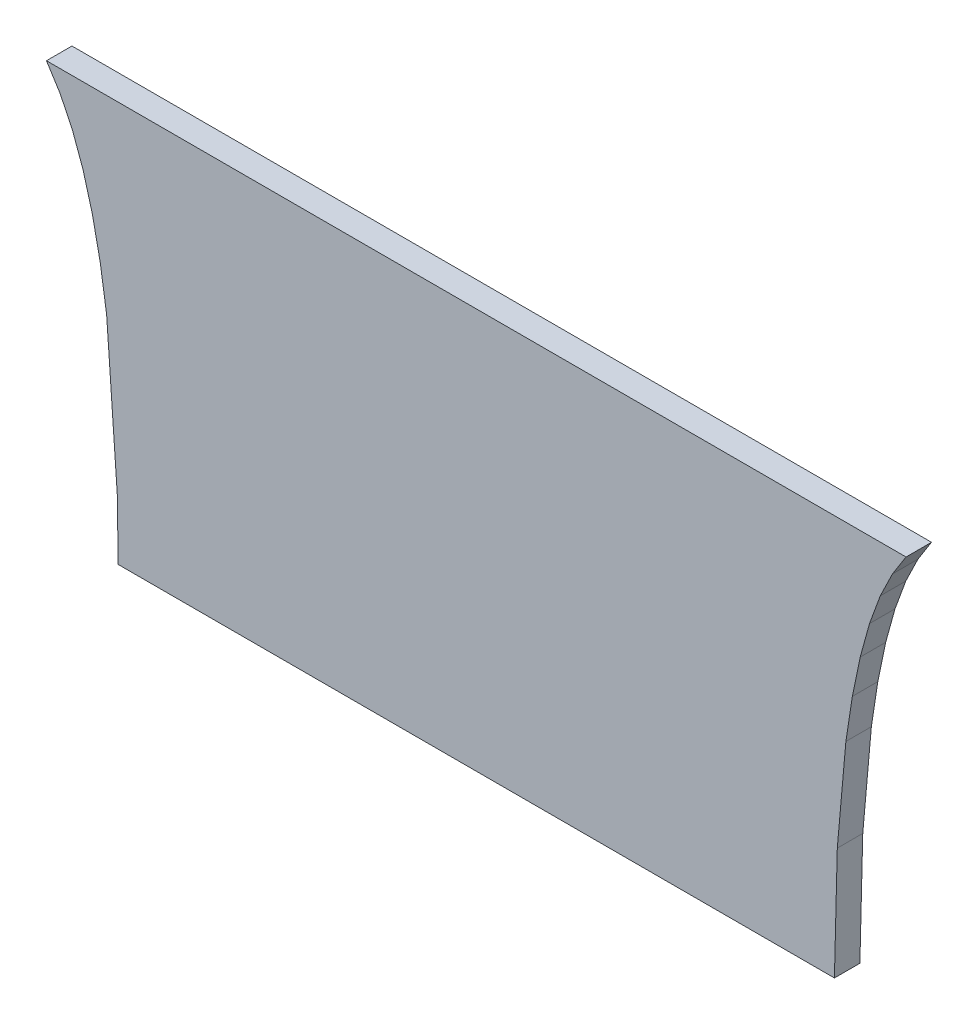
ISO-10303-21;
HEADER;
FILE_DESCRIPTION(('STEP AP214'),'2;1');
FILE_NAME('part.step','',(''),(''),'','','');
FILE_SCHEMA(('AUTOMOTIVE_DESIGN { 1 0 10303 214 1 1 1 1 }'));
ENDSEC;
DATA;
#1=APPLICATION_CONTEXT('core data for automotive mechanical design processes');
#2=APPLICATION_PROTOCOL_DEFINITION('international standard','automotive_design',2000,#1);
#3=PRODUCT_CONTEXT('',#1,'mechanical');
#4=PRODUCT('Part','Part','',(#3));
#5=PRODUCT_RELATED_PRODUCT_CATEGORY('part','',(#4));
#6=PRODUCT_DEFINITION_FORMATION('','',#4);
#7=PRODUCT_DEFINITION_CONTEXT('part definition',#1,'design');
#8=PRODUCT_DEFINITION('design','',#6,#7);
#9=PRODUCT_DEFINITION_SHAPE('','',#8);
#10=(LENGTH_UNIT() NAMED_UNIT(*) SI_UNIT(.MILLI.,.METRE.));
#11=(NAMED_UNIT(*) PLANE_ANGLE_UNIT() SI_UNIT($,.RADIAN.));
#12=(NAMED_UNIT(*) SI_UNIT($,.STERADIAN.) SOLID_ANGLE_UNIT());
#13=UNCERTAINTY_MEASURE_WITH_UNIT(LENGTH_MEASURE(1.E-05),#10,'distance_accuracy_value','');
#14=(GEOMETRIC_REPRESENTATION_CONTEXT(3) GLOBAL_UNCERTAINTY_ASSIGNED_CONTEXT((#13)) GLOBAL_UNIT_ASSIGNED_CONTEXT((#10,
#11,#12)) REPRESENTATION_CONTEXT('',''));
#15=CARTESIAN_POINT('',(0.,0.,0.));
#16=DIRECTION('',(0.,0.,1.));
#17=DIRECTION('',(1.,0.,0.));
#18=AXIS2_PLACEMENT_3D('',#15,#16,#17);
#19=CARTESIAN_POINT('',(88.4000015258789,42.5309982299805,0.));
#20=DIRECTION('',(-0.999684055752358,0.0251354067903474,0.));
#21=DIRECTION('',(0.0251354067903474,0.999684055752358,0.));
#22=AXIS2_PLACEMENT_3D('',#19,#20,#21);
#23=PLANE('',#22);
#24=DIRECTION('',(0.0251354067903474,0.999684055752358,0.));
#25=VECTOR('',#24,1.);
#26=CARTESIAN_POINT('',(88.4000015258789,42.5309982299805,0.03556));
#27=LINE('',#26,#25);
#28=CARTESIAN_POINT('',(88.4000015258789,42.5309982299805,0.03556));
#29=VERTEX_POINT('',#28);
#30=CARTESIAN_POINT('',(88.4039993286133,42.689998626709,0.03556));
#31=VERTEX_POINT('',#30);
#32=EDGE_CURVE('E11',#29,#31,#27,.T.);
#33=ORIENTED_EDGE('',*,*,#32,.F.);
#34=DIRECTION('',(0.,0.,1.));
#35=VECTOR('',#34,1.);
#36=CARTESIAN_POINT('',(88.4000015258789,42.5309982299805,0.));
#37=LINE('',#36,#35);
#38=CARTESIAN_POINT('',(88.4000015258789,42.5309982299805,0.));
#39=VERTEX_POINT('',#38);
#40=EDGE_CURVE('E24',#39,#29,#37,.T.);
#41=ORIENTED_EDGE('',*,*,#40,.F.);
#42=DIRECTION('',(0.0251354067903474,0.999684055752358,0.));
#43=VECTOR('',#42,1.);
#44=CARTESIAN_POINT('',(88.4000015258789,42.5309982299805,0.));
#45=LINE('',#44,#43);
#46=CARTESIAN_POINT('',(88.4039993286133,42.689998626709,0.));
#47=VERTEX_POINT('',#46);
#48=EDGE_CURVE('E160',#39,#47,#45,.T.);
#49=ORIENTED_EDGE('',*,*,#48,.T.);
#50=DIRECTION('',(0.,0.,1.));
#51=VECTOR('',#50,1.);
#52=CARTESIAN_POINT('',(88.4039993286133,42.689998626709,0.));
#53=LINE('',#52,#51);
#54=EDGE_CURVE('E37',#47,#31,#53,.T.);
#55=ORIENTED_EDGE('',*,*,#54,.T.);
#56=EDGE_LOOP('',(#33,#41,#49,#55));
#57=FACE_BOUND('',#56,.T.);
#58=ADVANCED_FACE('F17',(#57),#23,.F.);
#59=CARTESIAN_POINT('',(88.4039993286133,42.689998626709,0.));
#60=DIRECTION('',(-0.996072089069625,0.0885459958240475,0.));
#61=DIRECTION('',(0.0885459958240475,0.996072089069625,0.));
#62=AXIS2_PLACEMENT_3D('',#59,#60,#61);
#63=PLANE('',#62);
#64=DIRECTION('',(0.0885459958240475,0.996072089069625,0.));
#65=VECTOR('',#64,1.);
#66=CARTESIAN_POINT('',(88.4039993286133,42.689998626709,0.03556));
#67=LINE('',#66,#65);
#68=CARTESIAN_POINT('',(88.4160003662109,42.8250007629395,0.03556));
#69=VERTEX_POINT('',#68);
#70=EDGE_CURVE('E280',#31,#69,#67,.T.);
#71=ORIENTED_EDGE('',*,*,#70,.F.);
#72=ORIENTED_EDGE('',*,*,#54,.F.);
#73=DIRECTION('',(0.0885459958240475,0.996072089069625,0.));
#74=VECTOR('',#73,1.);
#75=CARTESIAN_POINT('',(88.4039993286133,42.689998626709,0.));
#76=LINE('',#75,#74);
#77=CARTESIAN_POINT('',(88.4160003662109,42.8250007629395,0.));
#78=VERTEX_POINT('',#77);
#79=EDGE_CURVE('E277',#47,#78,#76,.T.);
#80=ORIENTED_EDGE('',*,*,#79,.T.);
#81=DIRECTION('',(0.,0.,1.));
#82=VECTOR('',#81,1.);
#83=CARTESIAN_POINT('',(88.4160003662109,42.8250007629395,0.));
#84=LINE('',#83,#82);
#85=EDGE_CURVE('E275',#78,#69,#84,.T.);
#86=ORIENTED_EDGE('',*,*,#85,.T.);
#87=EDGE_LOOP('',(#71,#72,#80,#86));
#88=FACE_BOUND('',#87,.T.);
#89=ADVANCED_FACE('F288',(#88),#63,.F.);
#90=CARTESIAN_POINT('',(88.416000366211,42.8250007629395,0.));
#91=DIRECTION('',(-0.98855716875994,0.150846690694003,0.));
#92=DIRECTION('',(0.150846690694003,0.98855716875994,0.));
#93=AXIS2_PLACEMENT_3D('',#90,#91,#92);
#94=PLANE('',#93);
#95=DIRECTION('',(0.150846690694003,0.98855716875994,0.));
#96=VECTOR('',#95,1.);
#97=CARTESIAN_POINT('',(88.4160003662109,42.8250007629395,0.03556));
#98=LINE('',#97,#96);
#99=CARTESIAN_POINT('',(88.4250030517578,42.8839988708496,0.03556));
#100=VERTEX_POINT('',#99);
#101=EDGE_CURVE('E272',#69,#100,#98,.T.);
#102=ORIENTED_EDGE('',*,*,#101,.F.);
#103=ORIENTED_EDGE('',*,*,#85,.F.);
#104=DIRECTION('',(0.150846690694003,0.98855716875994,0.));
#105=VECTOR('',#104,1.);
#106=CARTESIAN_POINT('',(88.4160003662109,42.8250007629395,0.));
#107=LINE('',#106,#105);
#108=CARTESIAN_POINT('',(88.4250030517578,42.8839988708496,0.));
#109=VERTEX_POINT('',#108);
#110=EDGE_CURVE('E269',#78,#109,#107,.T.);
#111=ORIENTED_EDGE('',*,*,#110,.T.);
#112=DIRECTION('',(0.,0.,1.));
#113=VECTOR('',#112,1.);
#114=CARTESIAN_POINT('',(88.4250030517578,42.8839988708496,0.));
#115=LINE('',#114,#113);
#116=EDGE_CURVE('E267',#109,#100,#115,.T.);
#117=ORIENTED_EDGE('',*,*,#116,.T.);
#118=EDGE_LOOP('',(#102,#103,#111,#117));
#119=FACE_BOUND('',#118,.T.);
#120=ADVANCED_FACE('F294',(#119),#94,.F.);
#121=CARTESIAN_POINT('',(88.4250030517578,42.8839988708496,0.));
#122=DIRECTION('',(-0.979157113712778,0.203104275350527,0.));
#123=DIRECTION('',(0.203104275350527,0.979157113712778,0.));
#124=AXIS2_PLACEMENT_3D('',#121,#122,#123);
#125=PLANE('',#124);
#126=DIRECTION('',(0.203104275350527,0.979157113712778,0.));
#127=VECTOR('',#126,1.);
#128=CARTESIAN_POINT('',(88.4250030517578,42.8839988708496,0.03556));
#129=LINE('',#128,#127);
#130=CARTESIAN_POINT('',(88.4359970092774,42.9370002746582,0.03556));
#131=VERTEX_POINT('',#130);
#132=EDGE_CURVE('E264',#100,#131,#129,.T.);
#133=ORIENTED_EDGE('',*,*,#132,.F.);
#134=ORIENTED_EDGE('',*,*,#116,.F.);
#135=DIRECTION('',(0.203104275350527,0.979157113712778,0.));
#136=VECTOR('',#135,1.);
#137=CARTESIAN_POINT('',(88.4250030517578,42.8839988708496,0.));
#138=LINE('',#137,#136);
#139=CARTESIAN_POINT('',(88.4359970092774,42.9370002746582,0.));
#140=VERTEX_POINT('',#139);
#141=EDGE_CURVE('E261',#109,#140,#138,.T.);
#142=ORIENTED_EDGE('',*,*,#141,.T.);
#143=DIRECTION('',(0.,0.,1.));
#144=VECTOR('',#143,1.);
#145=CARTESIAN_POINT('',(88.4359970092774,42.9370002746582,0.));
#146=LINE('',#145,#144);
#147=EDGE_CURVE('E259',#140,#131,#146,.T.);
#148=ORIENTED_EDGE('',*,*,#147,.T.);
#149=EDGE_LOOP('',(#133,#134,#142,#148));
#150=FACE_BOUND('',#149,.T.);
#151=ADVANCED_FACE('F296',(#150),#125,.F.);
#152=CARTESIAN_POINT('',(88.4359970092774,42.9370002746582,0.));
#153=DIRECTION('',(-0.963809837327237,0.266590692769355,0.));
#154=DIRECTION('',(0.266590692769355,0.963809837327237,0.));
#155=AXIS2_PLACEMENT_3D('',#152,#153,#154);
#156=PLANE('',#155);
#157=DIRECTION('',(0.266590692769355,0.963809837327237,0.));
#158=VECTOR('',#157,1.);
#159=CARTESIAN_POINT('',(88.4359970092774,42.9370002746582,0.03556));
#160=LINE('',#159,#158);
#161=CARTESIAN_POINT('',(88.4489974975586,42.984001159668,0.03556));
#162=VERTEX_POINT('',#161);
#163=EDGE_CURVE('E256',#131,#162,#160,.T.);
#164=ORIENTED_EDGE('',*,*,#163,.F.);
#165=ORIENTED_EDGE('',*,*,#147,.F.);
#166=DIRECTION('',(0.266590692769355,0.963809837327237,0.));
#167=VECTOR('',#166,1.);
#168=CARTESIAN_POINT('',(88.4359970092774,42.9370002746582,0.));
#169=LINE('',#168,#167);
#170=CARTESIAN_POINT('',(88.4489974975586,42.984001159668,0.));
#171=VERTEX_POINT('',#170);
#172=EDGE_CURVE('E253',#140,#171,#169,.T.);
#173=ORIENTED_EDGE('',*,*,#172,.T.);
#174=DIRECTION('',(0.,0.,1.));
#175=VECTOR('',#174,1.);
#176=CARTESIAN_POINT('',(88.4489974975586,42.984001159668,0.));
#177=LINE('',#176,#175);
#178=EDGE_CURVE('E251',#171,#162,#177,.T.);
#179=ORIENTED_EDGE('',*,*,#178,.T.);
#180=EDGE_LOOP('',(#164,#165,#173,#179));
#181=FACE_BOUND('',#180,.T.);
#182=ADVANCED_FACE('F301',(#181),#156,.F.);
#183=CARTESIAN_POINT('',(88.4489974975586,42.984001159668,0.));
#184=DIRECTION('',(-0.939128353177272,0.343566494668128,0.));
#185=DIRECTION('',(0.343566494668128,0.939128353177272,0.));
#186=AXIS2_PLACEMENT_3D('',#183,#184,#185);
#187=PLANE('',#186);
#188=DIRECTION('',(0.343566494668128,0.939128353177272,0.));
#189=VECTOR('',#188,1.);
#190=CARTESIAN_POINT('',(88.4489974975586,42.984001159668,0.03556));
#191=LINE('',#190,#189);
#192=CARTESIAN_POINT('',(88.463996887207,43.0250015258789,0.03556));
#193=VERTEX_POINT('',#192);
#194=EDGE_CURVE('E248',#162,#193,#191,.T.);
#195=ORIENTED_EDGE('',*,*,#194,.F.);
#196=ORIENTED_EDGE('',*,*,#178,.F.);
#197=DIRECTION('',(0.343566494668128,0.939128353177272,0.));
#198=VECTOR('',#197,1.);
#199=CARTESIAN_POINT('',(88.4489974975586,42.984001159668,0.));
#200=LINE('',#199,#198);
#201=CARTESIAN_POINT('',(88.463996887207,43.0250015258789,0.));
#202=VERTEX_POINT('',#201);
#203=EDGE_CURVE('E245',#171,#202,#200,.T.);
#204=ORIENTED_EDGE('',*,*,#203,.T.);
#205=DIRECTION('',(0.,0.,1.));
#206=VECTOR('',#205,1.);
#207=CARTESIAN_POINT('',(88.463996887207,43.0250015258789,0.));
#208=LINE('',#207,#206);
#209=EDGE_CURVE('E243',#202,#193,#208,.T.);
#210=ORIENTED_EDGE('',*,*,#209,.T.);
#211=EDGE_LOOP('',(#195,#196,#204,#210));
#212=FACE_BOUND('',#211,.T.);
#213=ADVANCED_FACE('F304',(#212),#187,.F.);
#214=CARTESIAN_POINT('',(88.463996887207,43.0250015258789,0.));
#215=DIRECTION('',(-0.899447608111395,0.437028603483444,0.));
#216=DIRECTION('',(0.437028603483444,0.899447608111395,0.));
#217=AXIS2_PLACEMENT_3D('',#214,#215,#216);
#218=PLANE('',#217);
#219=DIRECTION('',(0.437028603483444,0.899447608111395,0.));
#220=VECTOR('',#219,1.);
#221=CARTESIAN_POINT('',(88.463996887207,43.0250015258789,0.03556));
#222=LINE('',#221,#220);
#223=CARTESIAN_POINT('',(88.4810028076172,43.060001373291,0.03556));
#224=VERTEX_POINT('',#223);
#225=EDGE_CURVE('E240',#193,#224,#222,.T.);
#226=ORIENTED_EDGE('',*,*,#225,.F.);
#227=ORIENTED_EDGE('',*,*,#209,.F.);
#228=DIRECTION('',(0.437028603483444,0.899447608111395,0.));
#229=VECTOR('',#228,1.);
#230=CARTESIAN_POINT('',(88.463996887207,43.0250015258789,0.));
#231=LINE('',#230,#229);
#232=CARTESIAN_POINT('',(88.4810028076172,43.060001373291,0.));
#233=VERTEX_POINT('',#232);
#234=EDGE_CURVE('E237',#202,#233,#231,.T.);
#235=ORIENTED_EDGE('',*,*,#234,.T.);
#236=DIRECTION('',(0.,0.,1.));
#237=VECTOR('',#236,1.);
#238=CARTESIAN_POINT('',(88.4810028076172,43.060001373291,0.));
#239=LINE('',#238,#237);
#240=EDGE_CURVE('E235',#233,#224,#239,.T.);
#241=ORIENTED_EDGE('',*,*,#240,.T.);
#242=EDGE_LOOP('',(#226,#227,#235,#241));
#243=FACE_BOUND('',#242,.T.);
#244=ADVANCED_FACE('F309',(#243),#218,.F.);
#245=CARTESIAN_POINT('',(88.4810028076172,43.060001373291,0.));
#246=DIRECTION('',(-0.844844974102474,0.535011186550142,0.));
#247=DIRECTION('',(0.535011186550142,0.844844974102474,0.));
#248=AXIS2_PLACEMENT_3D('',#245,#246,#247);
#249=PLANE('',#248);
#250=DIRECTION('',(0.535011186550142,0.844844974102474,0.));
#251=VECTOR('',#250,1.);
#252=CARTESIAN_POINT('',(88.4810028076172,43.060001373291,0.03556));
#253=LINE('',#252,#251);
#254=CARTESIAN_POINT('',(88.5,43.0900001525879,0.03556));
#255=VERTEX_POINT('',#254);
#256=EDGE_CURVE('E232',#224,#255,#253,.T.);
#257=ORIENTED_EDGE('',*,*,#256,.F.);
#258=ORIENTED_EDGE('',*,*,#240,.F.);
#259=DIRECTION('',(0.535011186550142,0.844844974102474,0.));
#260=VECTOR('',#259,1.);
#261=CARTESIAN_POINT('',(88.4810028076172,43.060001373291,0.));
#262=LINE('',#261,#260);
#263=CARTESIAN_POINT('',(88.5,43.0900001525879,0.));
#264=VERTEX_POINT('',#263);
#265=EDGE_CURVE('E229',#233,#264,#262,.T.);
#266=ORIENTED_EDGE('',*,*,#265,.T.);
#267=DIRECTION('',(0.,0.,1.));
#268=VECTOR('',#267,1.);
#269=CARTESIAN_POINT('',(88.5,43.0900001525879,0.));
#270=LINE('',#269,#268);
#271=EDGE_CURVE('E227',#264,#255,#270,.T.);
#272=ORIENTED_EDGE('',*,*,#271,.T.);
#273=EDGE_LOOP('',(#257,#258,#266,#272));
#274=FACE_BOUND('',#273,.T.);
#275=ADVANCED_FACE('F312',(#274),#249,.F.);
#276=CARTESIAN_POINT('',(88.5,43.0900001525879,0.));
#277=DIRECTION('',(0.,-1.,0.));
#278=DIRECTION('',(-1.,0.,0.));
#279=AXIS2_PLACEMENT_3D('',#276,#277,#278);
#280=PLANE('',#279);
#281=DIRECTION('',(-1.,0.,0.));
#282=VECTOR('',#281,1.);
#283=CARTESIAN_POINT('',(88.5,43.0900001525879,0.03556));
#284=LINE('',#283,#282);
#285=CARTESIAN_POINT('',(87.3000030517578,43.0900001525879,0.03556));
#286=VERTEX_POINT('',#285);
#287=EDGE_CURVE('E224',#255,#286,#284,.T.);
#288=ORIENTED_EDGE('',*,*,#287,.F.);
#289=ORIENTED_EDGE('',*,*,#271,.F.);
#290=DIRECTION('',(-1.,0.,0.));
#291=VECTOR('',#290,1.);
#292=CARTESIAN_POINT('',(88.5,43.0900001525879,0.));
#293=LINE('',#292,#291);
#294=CARTESIAN_POINT('',(87.3000030517578,43.0900001525879,0.));
#295=VERTEX_POINT('',#294);
#296=EDGE_CURVE('E221',#264,#295,#293,.T.);
#297=ORIENTED_EDGE('',*,*,#296,.T.);
#298=DIRECTION('',(0.,0.,1.));
#299=VECTOR('',#298,1.);
#300=CARTESIAN_POINT('',(87.3000030517578,43.0900001525879,0.));
#301=LINE('',#300,#299);
#302=EDGE_CURVE('E219',#295,#286,#301,.T.);
#303=ORIENTED_EDGE('',*,*,#302,.T.);
#304=EDGE_LOOP('',(#288,#289,#297,#303));
#305=FACE_BOUND('',#304,.T.);
#306=ADVANCED_FACE('F317',(#305),#280,.F.);
#307=CARTESIAN_POINT('',(87.3000030517578,43.0900001525879,0.));
#308=DIRECTION('',(0.844844974102474,0.535011186550142,0.));
#309=DIRECTION('',(0.535011186550142,-0.844844974102474,0.));
#310=AXIS2_PLACEMENT_3D('',#307,#308,#309);
#311=PLANE('',#310);
#312=DIRECTION('',(0.535011186550142,-0.844844974102474,0.));
#313=VECTOR('',#312,1.);
#314=CARTESIAN_POINT('',(87.3000030517578,43.0900001525879,0.03556));
#315=LINE('',#314,#313);
#316=CARTESIAN_POINT('',(87.3190002441406,43.060001373291,0.03556));
#317=VERTEX_POINT('',#316);
#318=EDGE_CURVE('E216',#286,#317,#315,.T.);
#319=ORIENTED_EDGE('',*,*,#318,.F.);
#320=ORIENTED_EDGE('',*,*,#302,.F.);
#321=DIRECTION('',(0.535011186550142,-0.844844974102474,0.));
#322=VECTOR('',#321,1.);
#323=CARTESIAN_POINT('',(87.3000030517578,43.0900001525879,0.));
#324=LINE('',#323,#322);
#325=CARTESIAN_POINT('',(87.3190002441406,43.060001373291,0.));
#326=VERTEX_POINT('',#325);
#327=EDGE_CURVE('E213',#295,#326,#324,.T.);
#328=ORIENTED_EDGE('',*,*,#327,.T.);
#329=DIRECTION('',(0.,0.,1.));
#330=VECTOR('',#329,1.);
#331=CARTESIAN_POINT('',(87.3190002441406,43.060001373291,0.));
#332=LINE('',#331,#330);
#333=EDGE_CURVE('E211',#326,#317,#332,.T.);
#334=ORIENTED_EDGE('',*,*,#333,.T.);
#335=EDGE_LOOP('',(#319,#320,#328,#334));
#336=FACE_BOUND('',#335,.T.);
#337=ADVANCED_FACE('F320',(#336),#311,.F.);
#338=CARTESIAN_POINT('',(87.3190002441406,43.060001373291,0.));
#339=DIRECTION('',(0.89952467075599,0.43686996543746,0.));
#340=DIRECTION('',(0.43686996543746,-0.89952467075599,0.));
#341=AXIS2_PLACEMENT_3D('',#338,#339,#340);
#342=PLANE('',#341);
#343=DIRECTION('',(0.43686996543746,-0.89952467075599,0.));
#344=VECTOR('',#343,1.);
#345=CARTESIAN_POINT('',(87.3190002441406,43.060001373291,0.03556));
#346=LINE('',#345,#344);
#347=CARTESIAN_POINT('',(87.3359985351562,43.0250015258789,0.03556));
#348=VERTEX_POINT('',#347);
#349=EDGE_CURVE('E208',#317,#348,#346,.T.);
#350=ORIENTED_EDGE('',*,*,#349,.F.);
#351=ORIENTED_EDGE('',*,*,#333,.F.);
#352=DIRECTION('',(0.43686996543746,-0.89952467075599,0.));
#353=VECTOR('',#352,1.);
#354=CARTESIAN_POINT('',(87.3190002441406,43.060001373291,0.));
#355=LINE('',#354,#353);
#356=CARTESIAN_POINT('',(87.3359985351562,43.0250015258789,0.));
#357=VERTEX_POINT('',#356);
#358=EDGE_CURVE('E205',#326,#357,#355,.T.);
#359=ORIENTED_EDGE('',*,*,#358,.T.);
#360=DIRECTION('',(0.,0.,1.));
#361=VECTOR('',#360,1.);
#362=CARTESIAN_POINT('',(87.3359985351562,43.0250015258789,0.));
#363=LINE('',#362,#361);
#364=EDGE_CURVE('E203',#357,#348,#363,.T.);
#365=ORIENTED_EDGE('',*,*,#364,.T.);
#366=EDGE_LOOP('',(#350,#351,#359,#365));
#367=FACE_BOUND('',#366,.T.);
#368=ADVANCED_FACE('F325',(#367),#342,.F.);
#369=CARTESIAN_POINT('',(87.3359985351562,43.0250015258789,0.));
#370=DIRECTION('',(0.939128353177272,0.343566494668128,0.));
#371=DIRECTION('',(0.343566494668128,-0.939128353177272,0.));
#372=AXIS2_PLACEMENT_3D('',#369,#370,#371);
#373=PLANE('',#372);
#374=DIRECTION('',(0.343566494668128,-0.939128353177272,0.));
#375=VECTOR('',#374,1.);
#376=CARTESIAN_POINT('',(87.3359985351562,43.0250015258789,0.03556));
#377=LINE('',#376,#375);
#378=CARTESIAN_POINT('',(87.3509979248047,42.984001159668,0.03556));
#379=VERTEX_POINT('',#378);
#380=EDGE_CURVE('E200',#348,#379,#377,.T.);
#381=ORIENTED_EDGE('',*,*,#380,.F.);
#382=ORIENTED_EDGE('',*,*,#364,.F.);
#383=DIRECTION('',(0.343566494668128,-0.939128353177272,0.));
#384=VECTOR('',#383,1.);
#385=CARTESIAN_POINT('',(87.3359985351562,43.0250015258789,0.));
#386=LINE('',#385,#384);
#387=CARTESIAN_POINT('',(87.3509979248047,42.984001159668,0.));
#388=VERTEX_POINT('',#387);
#389=EDGE_CURVE('E197',#357,#388,#386,.T.);
#390=ORIENTED_EDGE('',*,*,#389,.T.);
#391=DIRECTION('',(0.,0.,1.));
#392=VECTOR('',#391,1.);
#393=CARTESIAN_POINT('',(87.3509979248047,42.984001159668,0.));
#394=LINE('',#393,#392);
#395=EDGE_CURVE('E195',#388,#379,#394,.T.);
#396=ORIENTED_EDGE('',*,*,#395,.T.);
#397=EDGE_LOOP('',(#381,#382,#390,#396));
#398=FACE_BOUND('',#397,.T.);
#399=ADVANCED_FACE('F328',(#398),#373,.F.);
#400=CARTESIAN_POINT('',(87.3509979248047,42.984001159668,0.));
#401=DIRECTION('',(0.963809837327237,0.266590692769355,0.));
#402=DIRECTION('',(0.266590692769355,-0.963809837327237,0.));
#403=AXIS2_PLACEMENT_3D('',#400,#401,#402);
#404=PLANE('',#403);
#405=DIRECTION('',(0.266590692769355,-0.963809837327237,0.));
#406=VECTOR('',#405,1.);
#407=CARTESIAN_POINT('',(87.3509979248047,42.984001159668,0.03556));
#408=LINE('',#407,#406);
#409=CARTESIAN_POINT('',(87.3639984130859,42.9370002746582,0.03556));
#410=VERTEX_POINT('',#409);
#411=EDGE_CURVE('E192',#379,#410,#408,.T.);
#412=ORIENTED_EDGE('',*,*,#411,.F.);
#413=ORIENTED_EDGE('',*,*,#395,.F.);
#414=DIRECTION('',(0.266590692769355,-0.963809837327237,0.));
#415=VECTOR('',#414,1.);
#416=CARTESIAN_POINT('',(87.3509979248047,42.984001159668,0.));
#417=LINE('',#416,#415);
#418=CARTESIAN_POINT('',(87.3639984130859,42.9370002746582,0.));
#419=VERTEX_POINT('',#418);
#420=EDGE_CURVE('E189',#388,#419,#417,.T.);
#421=ORIENTED_EDGE('',*,*,#420,.T.);
#422=DIRECTION('',(0.,0.,1.));
#423=VECTOR('',#422,1.);
#424=CARTESIAN_POINT('',(87.3639984130859,42.9370002746582,0.));
#425=LINE('',#424,#423);
#426=EDGE_CURVE('E187',#419,#410,#425,.T.);
#427=ORIENTED_EDGE('',*,*,#426,.T.);
#428=EDGE_LOOP('',(#412,#413,#421,#427));
#429=FACE_BOUND('',#428,.T.);
#430=ADVANCED_FACE('F333',(#429),#404,.F.);
#431=CARTESIAN_POINT('',(87.3639984130859,42.9370002746582,0.));
#432=DIRECTION('',(0.979129074969474,0.203239402059303,0.));
#433=DIRECTION('',(0.203239402059303,-0.979129074969474,0.));
#434=AXIS2_PLACEMENT_3D('',#431,#432,#433);
#435=PLANE('',#434);
#436=DIRECTION('',(0.203239402059303,-0.979129074969473,0.));
#437=VECTOR('',#436,1.);
#438=CARTESIAN_POINT('',(87.3639984130859,42.9370002746582,0.03556));
#439=LINE('',#438,#437);
#440=CARTESIAN_POINT('',(87.375,42.8839988708496,0.03556));
#441=VERTEX_POINT('',#440);
#442=EDGE_CURVE('E184',#410,#441,#439,.T.);
#443=ORIENTED_EDGE('',*,*,#442,.F.);
#444=ORIENTED_EDGE('',*,*,#426,.F.);
#445=DIRECTION('',(0.203239402059303,-0.979129074969473,0.));
#446=VECTOR('',#445,1.);
#447=CARTESIAN_POINT('',(87.3639984130859,42.9370002746582,0.));
#448=LINE('',#447,#446);
#449=CARTESIAN_POINT('',(87.375,42.8839988708496,0.));
#450=VERTEX_POINT('',#449);
#451=EDGE_CURVE('E181',#419,#450,#448,.T.);
#452=ORIENTED_EDGE('',*,*,#451,.T.);
#453=DIRECTION('',(0.,0.,1.));
#454=VECTOR('',#453,1.);
#455=CARTESIAN_POINT('',(87.375,42.8839988708496,0.));
#456=LINE('',#455,#454);
#457=EDGE_CURVE('E179',#450,#441,#456,.T.);
#458=ORIENTED_EDGE('',*,*,#457,.T.);
#459=EDGE_LOOP('',(#443,#444,#452,#458));
#460=FACE_BOUND('',#459,.T.);
#461=ADVANCED_FACE('F336',(#460),#435,.F.);
#462=CARTESIAN_POINT('',(87.375,42.8839988708496,0.));
#463=DIRECTION('',(0.98855716875994,0.150846690694003,0.));
#464=DIRECTION('',(0.150846690694003,-0.98855716875994,0.));
#465=AXIS2_PLACEMENT_3D('',#462,#463,#464);
#466=PLANE('',#465);
#467=DIRECTION('',(0.150846690694003,-0.98855716875994,0.));
#468=VECTOR('',#467,1.);
#469=CARTESIAN_POINT('',(87.375,42.8839988708496,0.03556));
#470=LINE('',#469,#468);
#471=CARTESIAN_POINT('',(87.3840026855469,42.8250007629395,0.03556));
#472=VERTEX_POINT('',#471);
#473=EDGE_CURVE('E176',#441,#472,#470,.T.);
#474=ORIENTED_EDGE('',*,*,#473,.F.);
#475=ORIENTED_EDGE('',*,*,#457,.F.);
#476=DIRECTION('',(0.150846690694003,-0.98855716875994,0.));
#477=VECTOR('',#476,1.);
#478=CARTESIAN_POINT('',(87.375,42.8839988708496,0.));
#479=LINE('',#478,#477);
#480=CARTESIAN_POINT('',(87.3840026855469,42.8250007629395,0.));
#481=VERTEX_POINT('',#480);
#482=EDGE_CURVE('E173',#450,#481,#479,.T.);
#483=ORIENTED_EDGE('',*,*,#482,.T.);
#484=DIRECTION('',(0.,0.,1.));
#485=VECTOR('',#484,1.);
#486=CARTESIAN_POINT('',(87.3840026855469,42.8250007629395,0.));
#487=LINE('',#486,#485);
#488=EDGE_CURVE('E171',#481,#472,#487,.T.);
#489=ORIENTED_EDGE('',*,*,#488,.T.);
#490=EDGE_LOOP('',(#474,#475,#483,#489));
#491=FACE_BOUND('',#490,.T.);
#492=ADVANCED_FACE('F341',(#491),#466,.F.);
#493=CARTESIAN_POINT('',(87.3840026855469,42.8250007629395,0.));
#494=DIRECTION('',(0.997506488728673,0.0705748180599396,0.));
#495=DIRECTION('',(0.0705748180599396,-0.997506488728673,0.));
#496=AXIS2_PLACEMENT_3D('',#493,#494,#495);
#497=PLANE('',#496);
#498=DIRECTION('',(0.0705748180599396,-0.997506488728673,0.));
#499=VECTOR('',#498,1.);
#500=CARTESIAN_POINT('',(87.3840026855469,42.8250007629395,0.03556));
#501=LINE('',#500,#499);
#502=CARTESIAN_POINT('',(87.3990020751953,42.6129989624023,0.03556));
#503=VERTEX_POINT('',#502);
#504=EDGE_CURVE('E168',#472,#503,#501,.T.);
#505=ORIENTED_EDGE('',*,*,#504,.F.);
#506=ORIENTED_EDGE('',*,*,#488,.F.);
#507=DIRECTION('',(0.0705748180599396,-0.997506488728673,0.));
#508=VECTOR('',#507,1.);
#509=CARTESIAN_POINT('',(87.3840026855469,42.8250007629395,0.));
#510=LINE('',#509,#508);
#511=CARTESIAN_POINT('',(87.3990020751953,42.6129989624023,0.));
#512=VERTEX_POINT('',#511);
#513=EDGE_CURVE('E166',#481,#512,#510,.T.);
#514=ORIENTED_EDGE('',*,*,#513,.T.);
#515=DIRECTION('',(0.,0.,1.));
#516=VECTOR('',#515,1.);
#517=CARTESIAN_POINT('',(87.3990020751953,42.6129989624023,0.));
#518=LINE('',#517,#516);
#519=EDGE_CURVE('E151',#512,#503,#518,.T.);
#520=ORIENTED_EDGE('',*,*,#519,.T.);
#521=EDGE_LOOP('',(#505,#506,#514,#520));
#522=FACE_BOUND('',#521,.T.);
#523=ADVANCED_FACE('F343',(#522),#497,.F.);
#524=CARTESIAN_POINT('',(87.3990020751953,42.6129989624023,0.));
#525=DIRECTION('',(0.999925730774336,0.012187408888299,0.));
#526=DIRECTION('',(0.012187408888299,-0.999925730774336,0.));
#527=AXIS2_PLACEMENT_3D('',#524,#525,#526);
#528=PLANE('',#527);
#529=DIRECTION('',(0.012187408888299,-0.999925730774336,0.));
#530=VECTOR('',#529,1.);
#531=CARTESIAN_POINT('',(87.3990020751953,42.6129989624023,0.03556));
#532=LINE('',#531,#530);
#533=CARTESIAN_POINT('',(87.4000015258789,42.5309982299805,0.03556));
#534=VERTEX_POINT('',#533);
#535=EDGE_CURVE('E155',#503,#534,#532,.T.);
#536=ORIENTED_EDGE('',*,*,#535,.F.);
#537=ORIENTED_EDGE('',*,*,#519,.F.);
#538=DIRECTION('',(0.012187408888299,-0.999925730774336,0.));
#539=VECTOR('',#538,1.);
#540=CARTESIAN_POINT('',(87.3990020751953,42.6129989624023,0.));
#541=LINE('',#540,#539);
#542=CARTESIAN_POINT('',(87.4000015258789,42.5309982299805,0.));
#543=VERTEX_POINT('',#542);
#544=EDGE_CURVE('E147',#512,#543,#541,.T.);
#545=ORIENTED_EDGE('',*,*,#544,.T.);
#546=DIRECTION('',(0.,0.,1.));
#547=VECTOR('',#546,1.);
#548=CARTESIAN_POINT('',(87.4000015258789,42.5309982299805,0.));
#549=LINE('',#548,#547);
#550=EDGE_CURVE('E137',#543,#534,#549,.T.);
#551=ORIENTED_EDGE('',*,*,#550,.T.);
#552=EDGE_LOOP('',(#536,#537,#545,#551));
#553=FACE_BOUND('',#552,.T.);
#554=ADVANCED_FACE('F150',(#553),#528,.F.);
#555=CARTESIAN_POINT('',(87.4000015258789,42.5309982299805,0.));
#556=DIRECTION('',(0.,1.,0.));
#557=DIRECTION('',(1.,0.,0.));
#558=AXIS2_PLACEMENT_3D('',#555,#556,#557);
#559=PLANE('',#558);
#560=DIRECTION('',(1.,0.,0.));
#561=VECTOR('',#560,1.);
#562=CARTESIAN_POINT('',(87.4000015258789,42.5309982299805,0.03556));
#563=LINE('',#562,#561);
#564=EDGE_CURVE('E143',#534,#29,#563,.T.);
#565=ORIENTED_EDGE('',*,*,#564,.F.);
#566=ORIENTED_EDGE('',*,*,#550,.F.);
#567=DIRECTION('',(1.,0.,0.));
#568=VECTOR('',#567,1.);
#569=CARTESIAN_POINT('',(87.4000015258789,42.5309982299805,0.));
#570=LINE('',#569,#568);
#571=EDGE_CURVE('E141',#543,#39,#570,.T.);
#572=ORIENTED_EDGE('',*,*,#571,.T.);
#573=ORIENTED_EDGE('',*,*,#40,.T.);
#574=EDGE_LOOP('',(#565,#566,#572,#573));
#575=FACE_BOUND('',#574,.T.);
#576=ADVANCED_FACE('F139',(#575),#559,.F.);
#577=CARTESIAN_POINT('',(88.4000015258789,42.5309982299805,0.));
#578=DIRECTION('',(0.,0.,1.));
#579=DIRECTION('',(1.,0.,0.));
#580=AXIS2_PLACEMENT_3D('',#577,#578,#579);
#581=PLANE('',#580);
#582=ORIENTED_EDGE('',*,*,#571,.F.);
#583=ORIENTED_EDGE('',*,*,#544,.F.);
#584=ORIENTED_EDGE('',*,*,#513,.F.);
#585=ORIENTED_EDGE('',*,*,#482,.F.);
#586=ORIENTED_EDGE('',*,*,#451,.F.);
#587=ORIENTED_EDGE('',*,*,#420,.F.);
#588=ORIENTED_EDGE('',*,*,#389,.F.);
#589=ORIENTED_EDGE('',*,*,#358,.F.);
#590=ORIENTED_EDGE('',*,*,#327,.F.);
#591=ORIENTED_EDGE('',*,*,#296,.F.);
#592=ORIENTED_EDGE('',*,*,#265,.F.);
#593=ORIENTED_EDGE('',*,*,#234,.F.);
#594=ORIENTED_EDGE('',*,*,#203,.F.);
#595=ORIENTED_EDGE('',*,*,#172,.F.);
#596=ORIENTED_EDGE('',*,*,#141,.F.);
#597=ORIENTED_EDGE('',*,*,#110,.F.);
#598=ORIENTED_EDGE('',*,*,#79,.F.);
#599=ORIENTED_EDGE('',*,*,#48,.F.);
#600=EDGE_LOOP('',(#582,#583,#584,#585,#586,#587,#588,#589,#590,#591,#592,#593,#594,#595,#596,
#597,#598,#599));
#601=FACE_BOUND('',#600,.T.);
#602=ADVANCED_FACE('F158',(#601),#581,.F.);
#603=CARTESIAN_POINT('',(88.4000015258789,42.5309982299805,0.03556));
#604=DIRECTION('',(0.,0.,1.));
#605=DIRECTION('',(1.,0.,0.));
#606=AXIS2_PLACEMENT_3D('',#603,#604,#605);
#607=PLANE('',#606);
#608=ORIENTED_EDGE('',*,*,#32,.T.);
#609=ORIENTED_EDGE('',*,*,#70,.T.);
#610=ORIENTED_EDGE('',*,*,#101,.T.);
#611=ORIENTED_EDGE('',*,*,#132,.T.);
#612=ORIENTED_EDGE('',*,*,#163,.T.);
#613=ORIENTED_EDGE('',*,*,#194,.T.);
#614=ORIENTED_EDGE('',*,*,#225,.T.);
#615=ORIENTED_EDGE('',*,*,#256,.T.);
#616=ORIENTED_EDGE('',*,*,#287,.T.);
#617=ORIENTED_EDGE('',*,*,#318,.T.);
#618=ORIENTED_EDGE('',*,*,#349,.T.);
#619=ORIENTED_EDGE('',*,*,#380,.T.);
#620=ORIENTED_EDGE('',*,*,#411,.T.);
#621=ORIENTED_EDGE('',*,*,#442,.T.);
#622=ORIENTED_EDGE('',*,*,#473,.T.);
#623=ORIENTED_EDGE('',*,*,#504,.T.);
#624=ORIENTED_EDGE('',*,*,#535,.T.);
#625=ORIENTED_EDGE('',*,*,#564,.T.);
#626=EDGE_LOOP('',(#608,#609,#610,#611,#612,#613,#614,#615,#616,#617,#618,#619,#620,#621,#622,
#623,#624,#625));
#627=FACE_BOUND('',#626,.T.);
#628=ADVANCED_FACE('F291',(#627),#607,.T.);
#629=CLOSED_SHELL('',(#58,#89,#120,#151,#182,#213,#244,#275,#306,#337,#368,#399,#430,#461,#492,
#523,#554,#576,#602,#628));
#630=MANIFOLD_SOLID_BREP('B1',#629);
#631=ADVANCED_BREP_SHAPE_REPRESENTATION('',(#18,#630),#14);
#632=SHAPE_DEFINITION_REPRESENTATION(#9,#631);
ENDSEC;
END-ISO-10303-21;
